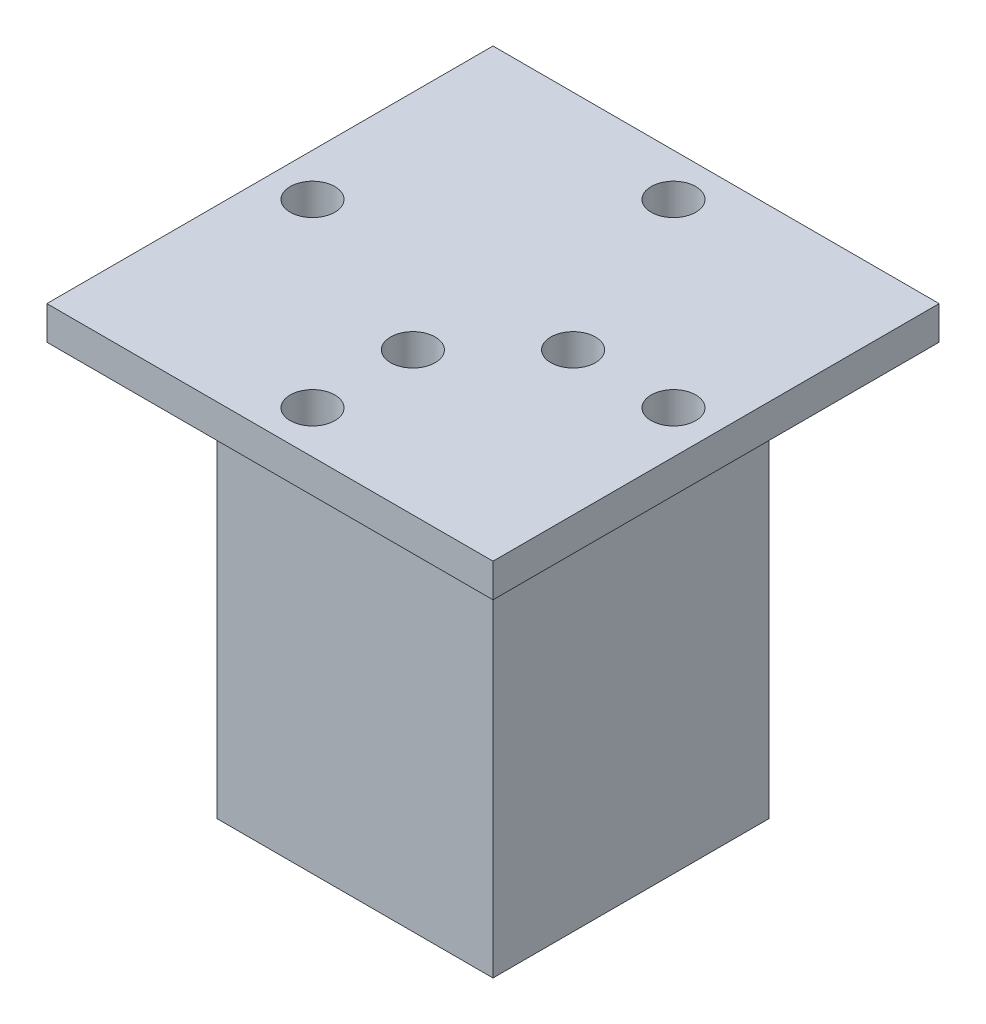
ISO-10303-21;
HEADER;
FILE_DESCRIPTION(('STEP AP214'),'2;1');
FILE_NAME('part.step','',(''),(''),'','','');
FILE_SCHEMA(('AUTOMOTIVE_DESIGN { 1 0 10303 214 1 1 1 1 }'));
ENDSEC;
DATA;
#1=APPLICATION_CONTEXT('core data for automotive mechanical design processes');
#2=APPLICATION_PROTOCOL_DEFINITION('international standard','automotive_design',2000,#1);
#3=PRODUCT_CONTEXT('',#1,'mechanical');
#4=PRODUCT('Part','Part','',(#3));
#5=PRODUCT_RELATED_PRODUCT_CATEGORY('part','',(#4));
#6=PRODUCT_DEFINITION_FORMATION('','',#4);
#7=PRODUCT_DEFINITION_CONTEXT('part definition',#1,'design');
#8=PRODUCT_DEFINITION('design','',#6,#7);
#9=PRODUCT_DEFINITION_SHAPE('','',#8);
#10=(LENGTH_UNIT() NAMED_UNIT(*) SI_UNIT(.MILLI.,.METRE.));
#11=(NAMED_UNIT(*) PLANE_ANGLE_UNIT() SI_UNIT($,.RADIAN.));
#12=(NAMED_UNIT(*) SI_UNIT($,.STERADIAN.) SOLID_ANGLE_UNIT());
#13=UNCERTAINTY_MEASURE_WITH_UNIT(LENGTH_MEASURE(1.E-05),#10,'distance_accuracy_value','');
#14=(GEOMETRIC_REPRESENTATION_CONTEXT(3) GLOBAL_UNCERTAINTY_ASSIGNED_CONTEXT((#13)) GLOBAL_UNIT_ASSIGNED_CONTEXT((#10,
#11,#12)) REPRESENTATION_CONTEXT('',''));
#15=CARTESIAN_POINT('',(0.,0.,0.));
#16=DIRECTION('',(0.,0.,1.));
#17=DIRECTION('',(1.,0.,0.));
#18=AXIS2_PLACEMENT_3D('',#15,#16,#17);
#19=CARTESIAN_POINT('',(0.,-5.66700000000001,0.));
#20=DIRECTION('',(0.,-1.,0.));
#21=DIRECTION('',(0.,0.,-1.));
#22=AXIS2_PLACEMENT_3D('',#19,#20,#21);
#23=PLANE('',#22);
#24=CARTESIAN_POINT('',(16.181933048136,-5.66700000000001,4.57442500314902E-13));
#25=DIRECTION('',(0.,-1.,0.));
#26=DIRECTION('',(0.,0.,-1.));
#27=AXIS2_PLACEMENT_3D('',#24,#25,#26);
#28=CIRCLE('',#27,2.00000000000017);
#29=CARTESIAN_POINT('',(16.181933048136,-5.66700000000001,-1.99999999999971));
#30=VERTEX_POINT('',#29);
#31=EDGE_CURVE('E161',#30,#30,#28,.F.);
#32=ORIENTED_EDGE('',*,*,#31,.T.);
#33=EDGE_LOOP('',(#32));
#34=FACE_BOUND('',#33,.T.);
#35=CARTESIAN_POINT('',(-16.181933048136,-5.66700000000001,0.));
#36=DIRECTION('',(0.,-1.,0.));
#37=DIRECTION('',(0.,0.,-1.));
#38=AXIS2_PLACEMENT_3D('',#35,#36,#37);
#39=CIRCLE('',#38,2.);
#40=CARTESIAN_POINT('',(-16.181933048136,-5.66700000000001,-2.));
#41=VERTEX_POINT('',#40);
#42=EDGE_CURVE('E155',#41,#41,#39,.F.);
#43=ORIENTED_EDGE('',*,*,#42,.T.);
#44=EDGE_LOOP('',(#43));
#45=FACE_BOUND('',#44,.T.);
#46=DIRECTION('',(0.,0.,-1.));
#47=VECTOR('',#46,1.);
#48=CARTESIAN_POINT('',(-20.,-5.66700000000001,20.));
#49=LINE('',#48,#47);
#50=CARTESIAN_POINT('',(-20.,-5.66700000000001,20.));
#51=VERTEX_POINT('',#50);
#52=CARTESIAN_POINT('',(-20.,-5.66700000000001,-20.));
#53=VERTEX_POINT('',#52);
#54=EDGE_CURVE('E116',#51,#53,#49,.T.);
#55=ORIENTED_EDGE('',*,*,#54,.T.);
#56=DIRECTION('',(1.,0.,0.));
#57=VECTOR('',#56,1.);
#58=CARTESIAN_POINT('',(-20.,-5.66700000000001,-20.));
#59=LINE('',#58,#57);
#60=CARTESIAN_POINT('',(20.,-5.66700000000001,-20.));
#61=VERTEX_POINT('',#60);
#62=EDGE_CURVE('E188',#53,#61,#59,.T.);
#63=ORIENTED_EDGE('',*,*,#62,.T.);
#64=DIRECTION('',(0.,0.,1.));
#65=VECTOR('',#64,1.);
#66=CARTESIAN_POINT('',(20.,-5.66700000000001,20.));
#67=LINE('',#66,#65);
#68=CARTESIAN_POINT('',(20.,-5.66700000000001,20.));
#69=VERTEX_POINT('',#68);
#70=EDGE_CURVE('E190',#61,#69,#67,.T.);
#71=ORIENTED_EDGE('',*,*,#70,.T.);
#72=DIRECTION('',(-1.,0.,0.));
#73=VECTOR('',#72,1.);
#74=CARTESIAN_POINT('',(-20.,-5.66700000000001,20.));
#75=LINE('',#74,#73);
#76=EDGE_CURVE('E130',#69,#51,#75,.T.);
#77=ORIENTED_EDGE('',*,*,#76,.T.);
#78=EDGE_LOOP('',(#55,#63,#71,#77));
#79=FACE_BOUND('',#78,.T.);
#80=DIRECTION('',(1.,0.,0.));
#81=VECTOR('',#80,1.);
#82=CARTESIAN_POINT('',(-12.363866096272,-5.66700000000001,-12.363866096272));
#83=LINE('',#82,#81);
#84=CARTESIAN_POINT('',(-12.363866096272,-5.66700000000001,-12.363866096272));
#85=VERTEX_POINT('',#84);
#86=CARTESIAN_POINT('',(12.363866096272,-5.66700000000001,-12.363866096272));
#87=VERTEX_POINT('',#86);
#88=EDGE_CURVE('E54',#85,#87,#83,.T.);
#89=ORIENTED_EDGE('',*,*,#88,.F.);
#90=DIRECTION('',(0.,0.,-1.));
#91=VECTOR('',#90,1.);
#92=CARTESIAN_POINT('',(-12.363866096272,-5.66700000000001,12.363866096272));
#93=LINE('',#92,#91);
#94=CARTESIAN_POINT('',(-12.363866096272,-5.66700000000001,12.363866096272));
#95=VERTEX_POINT('',#94);
#96=EDGE_CURVE('E158',#95,#85,#93,.T.);
#97=ORIENTED_EDGE('',*,*,#96,.F.);
#98=DIRECTION('',(-1.,0.,0.));
#99=VECTOR('',#98,1.);
#100=CARTESIAN_POINT('',(-12.363866096272,-5.66700000000001,12.363866096272));
#101=LINE('',#100,#99);
#102=CARTESIAN_POINT('',(12.363866096272,-5.66700000000001,12.363866096272));
#103=VERTEX_POINT('',#102);
#104=EDGE_CURVE('E183',#103,#95,#101,.T.);
#105=ORIENTED_EDGE('',*,*,#104,.F.);
#106=DIRECTION('',(0.,0.,1.));
#107=VECTOR('',#106,1.);
#108=CARTESIAN_POINT('',(12.363866096272,-5.66700000000001,12.363866096272));
#109=LINE('',#108,#107);
#110=EDGE_CURVE('E60',#87,#103,#109,.T.);
#111=ORIENTED_EDGE('',*,*,#110,.F.);
#112=EDGE_LOOP('',(#89,#97,#105,#111));
#113=FACE_BOUND('',#112,.T.);
#114=CARTESIAN_POINT('',(0.,-5.66700000000001,16.181933048136));
#115=DIRECTION('',(0.,-1.,0.));
#116=DIRECTION('',(0.,0.,-1.));
#117=AXIS2_PLACEMENT_3D('',#114,#115,#116);
#118=CIRCLE('',#117,2.);
#119=CARTESIAN_POINT('',(0.,-5.66700000000001,14.181933048136));
#120=VERTEX_POINT('',#119);
#121=EDGE_CURVE('E159',#120,#120,#118,.F.);
#122=ORIENTED_EDGE('',*,*,#121,.T.);
#123=EDGE_LOOP('',(#122));
#124=FACE_BOUND('',#123,.T.);
#125=CARTESIAN_POINT('',(2.30702965408593E-13,-5.66700000000001,-16.1819330481358));
#126=DIRECTION('',(0.,-1.,0.));
#127=DIRECTION('',(0.,0.,-1.));
#128=AXIS2_PLACEMENT_3D('',#125,#126,#127);
#129=CIRCLE('',#128,1.9999999999999);
#130=CARTESIAN_POINT('',(2.30702965408593E-13,-5.66700000000001,-18.1819330481357));
#131=VERTEX_POINT('',#130);
#132=EDGE_CURVE('E41',#131,#131,#129,.F.);
#133=ORIENTED_EDGE('',*,*,#132,.T.);
#134=EDGE_LOOP('',(#133));
#135=FACE_BOUND('',#134,.T.);
#136=ADVANCED_FACE('F37',(#34,#45,#79,#113,#124,#135),#23,.T.);
#137=CARTESIAN_POINT('',(-20.,-5.66700000000001,20.));
#138=DIRECTION('',(1.,0.,0.));
#139=DIRECTION('',(0.,0.,-1.));
#140=AXIS2_PLACEMENT_3D('',#137,#138,#139);
#141=PLANE('',#140);
#142=DIRECTION('',(0.,0.,-1.));
#143=VECTOR('',#142,1.);
#144=CARTESIAN_POINT('',(-20.,-2.66700000000001,20.));
#145=LINE('',#144,#143);
#146=CARTESIAN_POINT('',(-20.,-2.66700000000001,20.));
#147=VERTEX_POINT('',#146);
#148=CARTESIAN_POINT('',(-20.,-2.66700000000001,-20.));
#149=VERTEX_POINT('',#148);
#150=EDGE_CURVE('E111',#147,#149,#145,.T.);
#151=ORIENTED_EDGE('',*,*,#150,.T.);
#152=DIRECTION('',(0.,1.,0.));
#153=VECTOR('',#152,1.);
#154=CARTESIAN_POINT('',(-20.,-5.66700000000001,-20.));
#155=LINE('',#154,#153);
#156=EDGE_CURVE('E133',#53,#149,#155,.T.);
#157=ORIENTED_EDGE('',*,*,#156,.F.);
#158=ORIENTED_EDGE('',*,*,#54,.F.);
#159=DIRECTION('',(0.,1.,0.));
#160=VECTOR('',#159,1.);
#161=CARTESIAN_POINT('',(-20.,-5.66700000000001,20.));
#162=LINE('',#161,#160);
#163=EDGE_CURVE('E131',#51,#147,#162,.T.);
#164=ORIENTED_EDGE('',*,*,#163,.T.);
#165=EDGE_LOOP('',(#151,#157,#158,#164));
#166=FACE_BOUND('',#165,.T.);
#167=ADVANCED_FACE('F199',(#166),#141,.F.);
#168=CARTESIAN_POINT('',(-20.,-5.66700000000001,-20.));
#169=DIRECTION('',(0.,0.,1.));
#170=DIRECTION('',(1.,0.,0.));
#171=AXIS2_PLACEMENT_3D('',#168,#169,#170);
#172=PLANE('',#171);
#173=DIRECTION('',(1.,0.,0.));
#174=VECTOR('',#173,1.);
#175=CARTESIAN_POINT('',(-20.,-2.66700000000001,-20.));
#176=LINE('',#175,#174);
#177=CARTESIAN_POINT('',(20.,-2.66700000000001,-20.));
#178=VERTEX_POINT('',#177);
#179=EDGE_CURVE('E127',#149,#178,#176,.T.);
#180=ORIENTED_EDGE('',*,*,#179,.T.);
#181=DIRECTION('',(0.,1.,0.));
#182=VECTOR('',#181,1.);
#183=CARTESIAN_POINT('',(20.,-5.66700000000001,-20.));
#184=LINE('',#183,#182);
#185=EDGE_CURVE('E126',#61,#178,#184,.T.);
#186=ORIENTED_EDGE('',*,*,#185,.F.);
#187=ORIENTED_EDGE('',*,*,#62,.F.);
#188=ORIENTED_EDGE('',*,*,#156,.T.);
#189=EDGE_LOOP('',(#180,#186,#187,#188));
#190=FACE_BOUND('',#189,.T.);
#191=ADVANCED_FACE('F195',(#190),#172,.F.);
#192=CARTESIAN_POINT('',(20.,-5.66700000000001,20.));
#193=DIRECTION('',(-1.,0.,0.));
#194=DIRECTION('',(0.,0.,1.));
#195=AXIS2_PLACEMENT_3D('',#192,#193,#194);
#196=PLANE('',#195);
#197=DIRECTION('',(0.,0.,1.));
#198=VECTOR('',#197,1.);
#199=CARTESIAN_POINT('',(20.,-2.66700000000001,20.));
#200=LINE('',#199,#198);
#201=CARTESIAN_POINT('',(20.,-2.66700000000001,20.));
#202=VERTEX_POINT('',#201);
#203=EDGE_CURVE('E108',#178,#202,#200,.T.);
#204=ORIENTED_EDGE('',*,*,#203,.T.);
#205=DIRECTION('',(0.,1.,0.));
#206=VECTOR('',#205,1.);
#207=CARTESIAN_POINT('',(20.,-5.66700000000001,20.));
#208=LINE('',#207,#206);
#209=EDGE_CURVE('E123',#69,#202,#208,.T.);
#210=ORIENTED_EDGE('',*,*,#209,.F.);
#211=ORIENTED_EDGE('',*,*,#70,.F.);
#212=ORIENTED_EDGE('',*,*,#185,.T.);
#213=EDGE_LOOP('',(#204,#210,#211,#212));
#214=FACE_BOUND('',#213,.T.);
#215=ADVANCED_FACE('F121',(#214),#196,.F.);
#216=CARTESIAN_POINT('',(-20.,-5.66700000000001,20.));
#217=DIRECTION('',(0.,0.,-1.));
#218=DIRECTION('',(-1.,0.,0.));
#219=AXIS2_PLACEMENT_3D('',#216,#217,#218);
#220=PLANE('',#219);
#221=DIRECTION('',(-1.,0.,0.));
#222=VECTOR('',#221,1.);
#223=CARTESIAN_POINT('',(-20.,-2.66700000000001,20.));
#224=LINE('',#223,#222);
#225=EDGE_CURVE('E105',#202,#147,#224,.T.);
#226=ORIENTED_EDGE('',*,*,#225,.T.);
#227=ORIENTED_EDGE('',*,*,#163,.F.);
#228=ORIENTED_EDGE('',*,*,#76,.F.);
#229=ORIENTED_EDGE('',*,*,#209,.T.);
#230=EDGE_LOOP('',(#226,#227,#228,#229));
#231=FACE_BOUND('',#230,.T.);
#232=ADVANCED_FACE('F129',(#231),#220,.F.);
#233=CARTESIAN_POINT('',(0.,-42.667,0.));
#234=DIRECTION('',(0.,-1.,0.));
#235=DIRECTION('',(0.,0.,-1.));
#236=AXIS2_PLACEMENT_3D('',#233,#234,#235);
#237=PLANE('',#236);
#238=CARTESIAN_POINT('',(0.,-42.667,7.18193304813601));
#239=DIRECTION('',(0.,-1.,0.));
#240=DIRECTION('',(0.,0.,1.));
#241=AXIS2_PLACEMENT_3D('',#238,#239,#240);
#242=CIRCLE('',#241,2.);
#243=CARTESIAN_POINT('',(0.,-42.667,9.18193304813601));
#244=VERTEX_POINT('',#243);
#245=EDGE_CURVE('E335',#244,#244,#242,.T.);
#246=ORIENTED_EDGE('',*,*,#245,.F.);
#247=EDGE_LOOP('',(#246));
#248=FACE_BOUND('',#247,.T.);
#249=CARTESIAN_POINT('',(7.18193304813601,-42.667,0.));
#250=DIRECTION('',(0.,-1.,0.));
#251=DIRECTION('',(0.,0.,-1.));
#252=AXIS2_PLACEMENT_3D('',#249,#250,#251);
#253=CIRCLE('',#252,2.);
#254=CARTESIAN_POINT('',(7.18193304813601,-42.667,-2.));
#255=VERTEX_POINT('',#254);
#256=EDGE_CURVE('E337',#255,#255,#253,.T.);
#257=ORIENTED_EDGE('',*,*,#256,.F.);
#258=EDGE_LOOP('',(#257));
#259=FACE_BOUND('',#258,.T.);
#260=CARTESIAN_POINT('',(0.,-42.667,0.));
#261=DIRECTION('',(0.,-1.,0.));
#262=DIRECTION('',(0.,0.,-1.));
#263=AXIS2_PLACEMENT_3D('',#260,#261,#262);
#264=CIRCLE('',#263,2.);
#265=CARTESIAN_POINT('',(0.,-42.667,-2.));
#266=VERTEX_POINT('',#265);
#267=EDGE_CURVE('E170',#266,#266,#264,.T.);
#268=ORIENTED_EDGE('',*,*,#267,.F.);
#269=EDGE_LOOP('',(#268));
#270=FACE_BOUND('',#269,.T.);
#271=DIRECTION('',(1.,0.,0.));
#272=VECTOR('',#271,1.);
#273=CARTESIAN_POINT('',(0.,-42.667,-12.363866096272));
#274=LINE('',#273,#272);
#275=CARTESIAN_POINT('',(-12.363866096272,-42.667,-12.363866096272));
#276=VERTEX_POINT('',#275);
#277=CARTESIAN_POINT('',(12.363866096272,-42.667,-12.363866096272));
#278=VERTEX_POINT('',#277);
#279=EDGE_CURVE('E139',#276,#278,#274,.T.);
#280=ORIENTED_EDGE('',*,*,#279,.T.);
#281=DIRECTION('',(0.,0.,1.));
#282=VECTOR('',#281,1.);
#283=CARTESIAN_POINT('',(12.363866096272,-42.667,0.));
#284=LINE('',#283,#282);
#285=CARTESIAN_POINT('',(12.363866096272,-42.667,12.363866096272));
#286=VERTEX_POINT('',#285);
#287=EDGE_CURVE('E142',#278,#286,#284,.T.);
#288=ORIENTED_EDGE('',*,*,#287,.T.);
#289=DIRECTION('',(1.,0.,0.));
#290=VECTOR('',#289,1.);
#291=CARTESIAN_POINT('',(0.,-42.667,12.363866096272));
#292=LINE('',#291,#290);
#293=CARTESIAN_POINT('',(-12.363866096272,-42.667,12.363866096272));
#294=VERTEX_POINT('',#293);
#295=EDGE_CURVE('E144',#294,#286,#292,.T.);
#296=ORIENTED_EDGE('',*,*,#295,.F.);
#297=DIRECTION('',(0.,0.,1.));
#298=VECTOR('',#297,1.);
#299=CARTESIAN_POINT('',(-12.363866096272,-42.667,0.));
#300=LINE('',#299,#298);
#301=EDGE_CURVE('E147',#276,#294,#300,.T.);
#302=ORIENTED_EDGE('',*,*,#301,.F.);
#303=EDGE_LOOP('',(#280,#288,#296,#302));
#304=FACE_BOUND('',#303,.T.);
#305=ADVANCED_FACE('F228',(#248,#259,#270,#304),#237,.T.);
#306=CARTESIAN_POINT('',(-12.363866096272,-42.667,0.));
#307=DIRECTION('',(-1.,0.,0.));
#308=DIRECTION('',(0.,0.,1.));
#309=AXIS2_PLACEMENT_3D('',#306,#307,#308);
#310=PLANE('',#309);
#311=ORIENTED_EDGE('',*,*,#96,.T.);
#312=DIRECTION('',(0.,1.,0.));
#313=VECTOR('',#312,1.);
#314=CARTESIAN_POINT('',(-12.363866096272,-42.667,-12.363866096272));
#315=LINE('',#314,#313);
#316=EDGE_CURVE('E150',#276,#85,#315,.T.);
#317=ORIENTED_EDGE('',*,*,#316,.F.);
#318=ORIENTED_EDGE('',*,*,#301,.T.);
#319=DIRECTION('',(0.,1.,0.));
#320=VECTOR('',#319,1.);
#321=CARTESIAN_POINT('',(-12.363866096272,-42.667,12.363866096272));
#322=LINE('',#321,#320);
#323=EDGE_CURVE('E152',#294,#95,#322,.T.);
#324=ORIENTED_EDGE('',*,*,#323,.T.);
#325=EDGE_LOOP('',(#311,#317,#318,#324));
#326=FACE_BOUND('',#325,.T.);
#327=ADVANCED_FACE('F237',(#326),#310,.T.);
#328=CARTESIAN_POINT('',(0.,-42.667,12.363866096272));
#329=DIRECTION('',(0.,0.,1.));
#330=DIRECTION('',(1.,0.,0.));
#331=AXIS2_PLACEMENT_3D('',#328,#329,#330);
#332=PLANE('',#331);
#333=ORIENTED_EDGE('',*,*,#104,.T.);
#334=ORIENTED_EDGE('',*,*,#323,.F.);
#335=ORIENTED_EDGE('',*,*,#295,.T.);
#336=DIRECTION('',(0.,1.,0.));
#337=VECTOR('',#336,1.);
#338=CARTESIAN_POINT('',(12.363866096272,-42.667,12.363866096272));
#339=LINE('',#338,#337);
#340=EDGE_CURVE('E46',#286,#103,#339,.T.);
#341=ORIENTED_EDGE('',*,*,#340,.T.);
#342=EDGE_LOOP('',(#333,#334,#335,#341));
#343=FACE_BOUND('',#342,.T.);
#344=ADVANCED_FACE('F241',(#343),#332,.T.);
#345=CARTESIAN_POINT('',(12.363866096272,-42.667,0.));
#346=DIRECTION('',(-1.,0.,0.));
#347=DIRECTION('',(0.,0.,1.));
#348=AXIS2_PLACEMENT_3D('',#345,#346,#347);
#349=PLANE('',#348);
#350=DIRECTION('',(0.,1.,0.));
#351=VECTOR('',#350,1.);
#352=CARTESIAN_POINT('',(12.363866096272,-42.667,-12.363866096272));
#353=LINE('',#352,#351);
#354=EDGE_CURVE('E11',#278,#87,#353,.T.);
#355=ORIENTED_EDGE('',*,*,#354,.T.);
#356=ORIENTED_EDGE('',*,*,#110,.T.);
#357=ORIENTED_EDGE('',*,*,#340,.F.);
#358=ORIENTED_EDGE('',*,*,#287,.F.);
#359=EDGE_LOOP('',(#355,#356,#357,#358));
#360=FACE_BOUND('',#359,.T.);
#361=ADVANCED_FACE('F244',(#360),#349,.F.);
#362=CARTESIAN_POINT('',(0.,-42.667,-12.363866096272));
#363=DIRECTION('',(0.,0.,1.));
#364=DIRECTION('',(1.,0.,0.));
#365=AXIS2_PLACEMENT_3D('',#362,#363,#364);
#366=PLANE('',#365);
#367=ORIENTED_EDGE('',*,*,#316,.T.);
#368=ORIENTED_EDGE('',*,*,#88,.T.);
#369=ORIENTED_EDGE('',*,*,#354,.F.);
#370=ORIENTED_EDGE('',*,*,#279,.F.);
#371=EDGE_LOOP('',(#367,#368,#369,#370));
#372=FACE_BOUND('',#371,.T.);
#373=ADVANCED_FACE('F39',(#372),#366,.F.);
#374=CARTESIAN_POINT('',(-16.181933048136,-42.667,0.));
#375=DIRECTION('',(0.,1.,0.));
#376=DIRECTION('',(0.,0.,1.));
#377=AXIS2_PLACEMENT_3D('',#374,#375,#376);
#378=CYLINDRICAL_SURFACE('',#377,2.);
#379=CARTESIAN_POINT('',(-16.181933048136,-2.66700000000001,0.));
#380=DIRECTION('',(0.,-1.,0.));
#381=DIRECTION('',(0.,0.,-1.));
#382=AXIS2_PLACEMENT_3D('',#379,#380,#381);
#383=CIRCLE('',#382,2.);
#384=CARTESIAN_POINT('',(-16.181933048136,-2.66700000000001,-2.));
#385=VERTEX_POINT('',#384);
#386=EDGE_CURVE('E175',#385,#385,#383,.T.);
#387=ORIENTED_EDGE('',*,*,#386,.F.);
#388=EDGE_LOOP('',(#387));
#389=FACE_BOUND('',#388,.T.);
#390=ORIENTED_EDGE('',*,*,#42,.F.);
#391=EDGE_LOOP('',(#390));
#392=FACE_BOUND('',#391,.T.);
#393=ADVANCED_FACE('F211',(#389,#392),#378,.F.);
#394=CARTESIAN_POINT('',(0.,-42.667,16.181933048136));
#395=DIRECTION('',(0.,1.,0.));
#396=DIRECTION('',(0.,0.,1.));
#397=AXIS2_PLACEMENT_3D('',#394,#395,#396);
#398=CYLINDRICAL_SURFACE('',#397,2.);
#399=CARTESIAN_POINT('',(0.,-2.66700000000001,16.181933048136));
#400=DIRECTION('',(0.,-1.,0.));
#401=DIRECTION('',(0.,0.,-1.));
#402=AXIS2_PLACEMENT_3D('',#399,#400,#401);
#403=CIRCLE('',#402,2.);
#404=CARTESIAN_POINT('',(0.,-2.66700000000001,14.181933048136));
#405=VERTEX_POINT('',#404);
#406=EDGE_CURVE('E350',#405,#405,#403,.T.);
#407=ORIENTED_EDGE('',*,*,#406,.F.);
#408=EDGE_LOOP('',(#407));
#409=FACE_BOUND('',#408,.T.);
#410=ORIENTED_EDGE('',*,*,#121,.F.);
#411=EDGE_LOOP('',(#410));
#412=FACE_BOUND('',#411,.T.);
#413=ADVANCED_FACE('F208',(#409,#412),#398,.F.);
#414=CARTESIAN_POINT('',(16.181933048136,-42.667,4.57442500314902E-13));
#415=DIRECTION('',(0.,1.,0.));
#416=DIRECTION('',(0.,0.,1.));
#417=AXIS2_PLACEMENT_3D('',#414,#415,#416);
#418=CYLINDRICAL_SURFACE('',#417,2.00000000000017);
#419=CARTESIAN_POINT('',(16.181933048136,-2.66700000000001,4.57442500314902E-13));
#420=DIRECTION('',(0.,-1.,0.));
#421=DIRECTION('',(0.,0.,-1.));
#422=AXIS2_PLACEMENT_3D('',#419,#420,#421);
#423=CIRCLE('',#422,2.00000000000017);
#424=CARTESIAN_POINT('',(16.181933048136,-2.66700000000001,-1.99999999999971));
#425=VERTEX_POINT('',#424);
#426=EDGE_CURVE('E348',#425,#425,#423,.T.);
#427=ORIENTED_EDGE('',*,*,#426,.F.);
#428=EDGE_LOOP('',(#427));
#429=FACE_BOUND('',#428,.T.);
#430=ORIENTED_EDGE('',*,*,#31,.F.);
#431=EDGE_LOOP('',(#430));
#432=FACE_BOUND('',#431,.T.);
#433=ADVANCED_FACE('F210',(#429,#432),#418,.F.);
#434=CARTESIAN_POINT('',(2.30702965408593E-13,-42.667,-16.1819330481358));
#435=DIRECTION('',(0.,1.,0.));
#436=DIRECTION('',(0.,0.,1.));
#437=AXIS2_PLACEMENT_3D('',#434,#435,#436);
#438=CYLINDRICAL_SURFACE('',#437,1.9999999999999);
#439=CARTESIAN_POINT('',(2.30702965408593E-13,-2.66700000000001,-16.1819330481358));
#440=DIRECTION('',(0.,-1.,0.));
#441=DIRECTION('',(0.,0.,-1.));
#442=AXIS2_PLACEMENT_3D('',#439,#440,#441);
#443=CIRCLE('',#442,1.9999999999999);
#444=CARTESIAN_POINT('',(2.30702965408593E-13,-2.66700000000001,-18.1819330481357));
#445=VERTEX_POINT('',#444);
#446=EDGE_CURVE('E343',#445,#445,#443,.T.);
#447=ORIENTED_EDGE('',*,*,#446,.F.);
#448=EDGE_LOOP('',(#447));
#449=FACE_BOUND('',#448,.T.);
#450=ORIENTED_EDGE('',*,*,#132,.F.);
#451=EDGE_LOOP('',(#450));
#452=FACE_BOUND('',#451,.T.);
#453=ADVANCED_FACE('F218',(#449,#452),#438,.F.);
#454=CARTESIAN_POINT('',(0.,-32.667,0.));
#455=DIRECTION('',(0.,-1.,0.));
#456=DIRECTION('',(0.,0.,-1.));
#457=AXIS2_PLACEMENT_3D('',#454,#455,#456);
#458=CYLINDRICAL_SURFACE('',#457,2.);
#459=CARTESIAN_POINT('',(0.,-32.667,0.));
#460=DIRECTION('',(0.,-1.,0.));
#461=DIRECTION('',(0.,0.,-1.));
#462=AXIS2_PLACEMENT_3D('',#459,#460,#461);
#463=CIRCLE('',#462,2.);
#464=CARTESIAN_POINT('',(0.,-32.667,-2.));
#465=VERTEX_POINT('',#464);
#466=EDGE_CURVE('E166',#465,#465,#463,.T.);
#467=ORIENTED_EDGE('',*,*,#466,.F.);
#468=EDGE_LOOP('',(#467));
#469=FACE_BOUND('',#468,.T.);
#470=ORIENTED_EDGE('',*,*,#267,.T.);
#471=EDGE_LOOP('',(#470));
#472=FACE_BOUND('',#471,.T.);
#473=ADVANCED_FACE('F282',(#469,#472),#458,.F.);
#474=CARTESIAN_POINT('',(0.,-32.667,0.));
#475=DIRECTION('',(0.,-1.,0.));
#476=DIRECTION('',(0.,0.,-1.));
#477=AXIS2_PLACEMENT_3D('',#474,#475,#476);
#478=PLANE('',#477);
#479=ORIENTED_EDGE('',*,*,#466,.T.);
#480=EDGE_LOOP('',(#479));
#481=FACE_BOUND('',#480,.T.);
#482=ADVANCED_FACE('F291',(#481),#478,.T.);
#483=CARTESIAN_POINT('',(-55.8270272813263,-2.66700000000001,33.2231493875283));
#484=DIRECTION('',(0.,-1.,0.));
#485=DIRECTION('',(0.,0.,-1.));
#486=AXIS2_PLACEMENT_3D('',#483,#484,#485);
#487=PLANE('',#486);
#488=CARTESIAN_POINT('',(0.,-2.66700000000001,7.18193304813601));
#489=DIRECTION('',(0.,-1.,0.));
#490=DIRECTION('',(0.,0.,1.));
#491=AXIS2_PLACEMENT_3D('',#488,#489,#490);
#492=CIRCLE('',#491,2.);
#493=CARTESIAN_POINT('',(0.,-2.66700000000001,9.18193304813601));
#494=VERTEX_POINT('',#493);
#495=EDGE_CURVE('E332',#494,#494,#492,.T.);
#496=ORIENTED_EDGE('',*,*,#495,.T.);
#497=EDGE_LOOP('',(#496));
#498=FACE_BOUND('',#497,.T.);
#499=CARTESIAN_POINT('',(7.18193304813601,-2.66700000000001,0.));
#500=DIRECTION('',(0.,-1.,0.));
#501=DIRECTION('',(0.,0.,-1.));
#502=AXIS2_PLACEMENT_3D('',#499,#500,#501);
#503=CIRCLE('',#502,2.);
#504=CARTESIAN_POINT('',(7.18193304813601,-2.66700000000001,-2.));
#505=VERTEX_POINT('',#504);
#506=EDGE_CURVE('E340',#505,#505,#503,.T.);
#507=ORIENTED_EDGE('',*,*,#506,.T.);
#508=EDGE_LOOP('',(#507));
#509=FACE_BOUND('',#508,.T.);
#510=ORIENTED_EDGE('',*,*,#446,.T.);
#511=EDGE_LOOP('',(#510));
#512=FACE_BOUND('',#511,.T.);
#513=ORIENTED_EDGE('',*,*,#426,.T.);
#514=EDGE_LOOP('',(#513));
#515=FACE_BOUND('',#514,.T.);
#516=ORIENTED_EDGE('',*,*,#406,.T.);
#517=EDGE_LOOP('',(#516));
#518=FACE_BOUND('',#517,.T.);
#519=ORIENTED_EDGE('',*,*,#386,.T.);
#520=EDGE_LOOP('',(#519));
#521=FACE_BOUND('',#520,.T.);
#522=ORIENTED_EDGE('',*,*,#225,.F.);
#523=ORIENTED_EDGE('',*,*,#203,.F.);
#524=ORIENTED_EDGE('',*,*,#179,.F.);
#525=ORIENTED_EDGE('',*,*,#150,.F.);
#526=EDGE_LOOP('',(#522,#523,#524,#525));
#527=FACE_BOUND('',#526,.T.);
#528=ADVANCED_FACE('F107',(#498,#509,#512,#515,#518,#521,#527),#487,.F.);
#529=CARTESIAN_POINT('',(7.18193304813601,-2.66700000000001,0.));
#530=DIRECTION('',(0.,-1.,0.));
#531=DIRECTION('',(0.,0.,-1.));
#532=AXIS2_PLACEMENT_3D('',#529,#530,#531);
#533=CYLINDRICAL_SURFACE('',#532,2.);
#534=ORIENTED_EDGE('',*,*,#506,.F.);
#535=EDGE_LOOP('',(#534));
#536=FACE_BOUND('',#535,.T.);
#537=ORIENTED_EDGE('',*,*,#256,.T.);
#538=EDGE_LOOP('',(#537));
#539=FACE_BOUND('',#538,.T.);
#540=ADVANCED_FACE('F305',(#536,#539),#533,.F.);
#541=CARTESIAN_POINT('',(0.,-2.66700000000001,7.18193304813601));
#542=DIRECTION('',(0.,-1.,0.));
#543=DIRECTION('',(0.,0.,-1.));
#544=AXIS2_PLACEMENT_3D('',#541,#542,#543);
#545=CYLINDRICAL_SURFACE('',#544,2.);
#546=ORIENTED_EDGE('',*,*,#495,.F.);
#547=EDGE_LOOP('',(#546));
#548=FACE_BOUND('',#547,.T.);
#549=ORIENTED_EDGE('',*,*,#245,.T.);
#550=EDGE_LOOP('',(#549));
#551=FACE_BOUND('',#550,.T.);
#552=ADVANCED_FACE('F315',(#548,#551),#545,.F.);
#553=CLOSED_SHELL('',(#136,#167,#191,#215,#232,#305,#327,#344,#361,#373,#393,#413,#433,#453,
#473,#482,#528,#540,#552));
#554=MANIFOLD_SOLID_BREP('B2',#553);
#555=ADVANCED_BREP_SHAPE_REPRESENTATION('',(#18,#554),#14);
#556=SHAPE_DEFINITION_REPRESENTATION(#9,#555);
ENDSEC;
END-ISO-10303-21;
